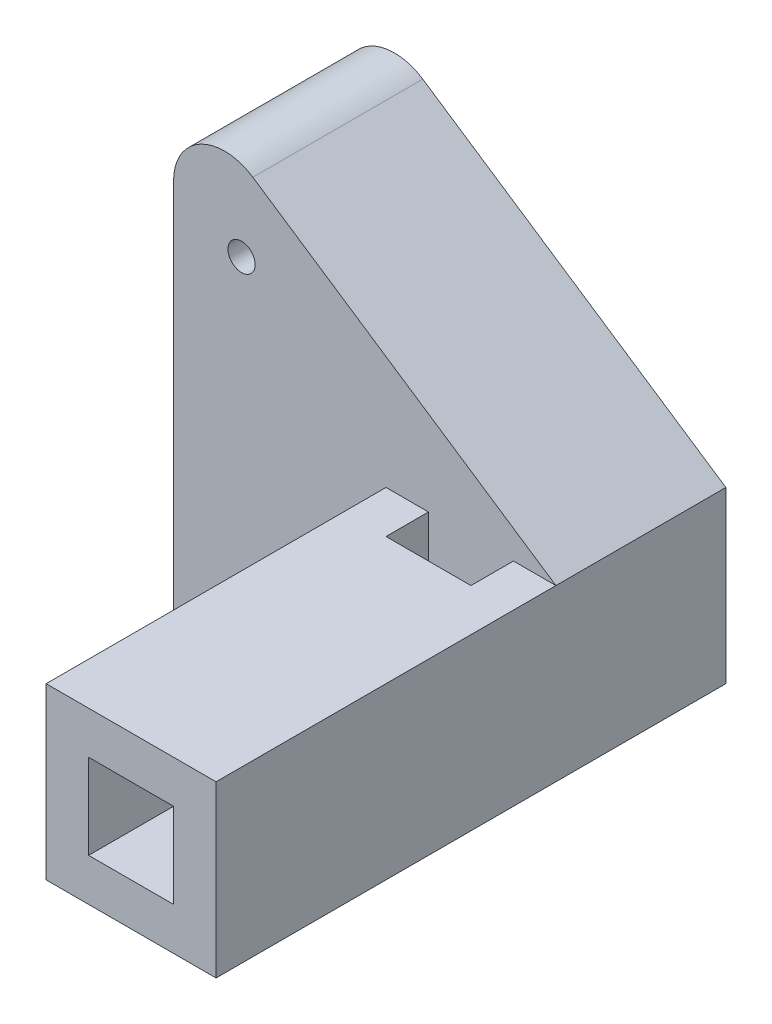
ISO-10303-21;
HEADER;
FILE_DESCRIPTION(('STEP AP214'),'2;1');
FILE_NAME('part.step','',(''),(''),'','','');
FILE_SCHEMA(('AUTOMOTIVE_DESIGN { 1 0 10303 214 1 1 1 1 }'));
ENDSEC;
DATA;
#1=APPLICATION_CONTEXT('core data for automotive mechanical design processes');
#2=APPLICATION_PROTOCOL_DEFINITION('international standard','automotive_design',2000,#1);
#3=PRODUCT_CONTEXT('',#1,'mechanical');
#4=PRODUCT('Part','Part','',(#3));
#5=PRODUCT_RELATED_PRODUCT_CATEGORY('part','',(#4));
#6=PRODUCT_DEFINITION_FORMATION('','',#4);
#7=PRODUCT_DEFINITION_CONTEXT('part definition',#1,'design');
#8=PRODUCT_DEFINITION('design','',#6,#7);
#9=PRODUCT_DEFINITION_SHAPE('','',#8);
#10=(LENGTH_UNIT() NAMED_UNIT(*) SI_UNIT(.MILLI.,.METRE.));
#11=(NAMED_UNIT(*) PLANE_ANGLE_UNIT() SI_UNIT($,.RADIAN.));
#12=(NAMED_UNIT(*) SI_UNIT($,.STERADIAN.) SOLID_ANGLE_UNIT());
#13=UNCERTAINTY_MEASURE_WITH_UNIT(LENGTH_MEASURE(1.E-05),#10,'distance_accuracy_value','');
#14=(GEOMETRIC_REPRESENTATION_CONTEXT(3) GLOBAL_UNCERTAINTY_ASSIGNED_CONTEXT((#13)) GLOBAL_UNIT_ASSIGNED_CONTEXT((#10,
#11,#12)) REPRESENTATION_CONTEXT('',''));
#15=CARTESIAN_POINT('',(0.,0.,0.));
#16=DIRECTION('',(0.,0.,1.));
#17=DIRECTION('',(1.,0.,0.));
#18=AXIS2_PLACEMENT_3D('',#15,#16,#17);
#19=CARTESIAN_POINT('',(-5.,-5.,60.));
#20=DIRECTION('',(1.,0.,0.));
#21=DIRECTION('',(0.,0.,-1.));
#22=AXIS2_PLACEMENT_3D('',#19,#20,#21);
#23=PLANE('',#22);
#24=DIRECTION('',(0.,1.,0.));
#25=VECTOR('',#24,1.);
#26=CARTESIAN_POINT('',(-5.,-5.,20.));
#27=LINE('',#26,#25);
#28=CARTESIAN_POINT('',(-5.,-5.,20.));
#29=VERTEX_POINT('',#28);
#30=CARTESIAN_POINT('',(-5.,15.,20.));
#31=VERTEX_POINT('',#30);
#32=EDGE_CURVE('E250',#29,#31,#27,.T.);
#33=ORIENTED_EDGE('',*,*,#32,.F.);
#34=DIRECTION('',(0.,0.,-1.));
#35=VECTOR('',#34,1.);
#36=CARTESIAN_POINT('',(-5.,-5.,60.));
#37=LINE('',#36,#35);
#38=CARTESIAN_POINT('',(-5.,-5.,60.));
#39=VERTEX_POINT('',#38);
#40=EDGE_CURVE('E330',#39,#29,#37,.T.);
#41=ORIENTED_EDGE('',*,*,#40,.F.);
#42=DIRECTION('',(0.,-1.,0.));
#43=VECTOR('',#42,1.);
#44=CARTESIAN_POINT('',(-5.,-5.,60.));
#45=LINE('',#44,#43);
#46=CARTESIAN_POINT('',(-5.,15.,60.));
#47=VERTEX_POINT('',#46);
#48=EDGE_CURVE('E311',#47,#39,#45,.T.);
#49=ORIENTED_EDGE('',*,*,#48,.F.);
#50=DIRECTION('',(0.,0.,-1.));
#51=VECTOR('',#50,1.);
#52=CARTESIAN_POINT('',(-5.,15.,60.));
#53=LINE('',#52,#51);
#54=EDGE_CURVE('E320',#47,#31,#53,.T.);
#55=ORIENTED_EDGE('',*,*,#54,.T.);
#56=EDGE_LOOP('',(#33,#41,#49,#55));
#57=FACE_BOUND('',#56,.T.);
#58=ADVANCED_FACE('F36',(#57),#23,.F.);
#59=CARTESIAN_POINT('',(-5.,-5.,60.));
#60=DIRECTION('',(0.,1.,0.));
#61=DIRECTION('',(0.,0.,1.));
#62=AXIS2_PLACEMENT_3D('',#59,#60,#61);
#63=PLANE('',#62);
#64=DIRECTION('',(-1.,0.,0.));
#65=VECTOR('',#64,1.);
#66=CARTESIAN_POINT('',(15.,-5.,20.));
#67=LINE('',#66,#65);
#68=CARTESIAN_POINT('',(15.,-5.,20.));
#69=VERTEX_POINT('',#68);
#70=CARTESIAN_POINT('',(10.,-5.,20.));
#71=VERTEX_POINT('',#70);
#72=EDGE_CURVE('E381',#69,#71,#67,.T.);
#73=ORIENTED_EDGE('',*,*,#72,.F.);
#74=DIRECTION('',(0.,0.,-1.));
#75=VECTOR('',#74,1.);
#76=CARTESIAN_POINT('',(15.,-5.,60.));
#77=LINE('',#76,#75);
#78=CARTESIAN_POINT('',(15.,-5.,60.));
#79=VERTEX_POINT('',#78);
#80=EDGE_CURVE('E327',#79,#69,#77,.T.);
#81=ORIENTED_EDGE('',*,*,#80,.F.);
#82=DIRECTION('',(1.,0.,0.));
#83=VECTOR('',#82,1.);
#84=CARTESIAN_POINT('',(-5.,-5.,60.));
#85=LINE('',#84,#83);
#86=EDGE_CURVE('E314',#39,#79,#85,.T.);
#87=ORIENTED_EDGE('',*,*,#86,.F.);
#88=ORIENTED_EDGE('',*,*,#40,.T.);
#89=CARTESIAN_POINT('',(0.,-5.,20.));
#90=VERTEX_POINT('',#89);
#91=EDGE_CURVE('E239',#90,#29,#67,.T.);
#92=ORIENTED_EDGE('',*,*,#91,.F.);
#93=DIRECTION('',(0.,0.,1.));
#94=VECTOR('',#93,1.);
#95=CARTESIAN_POINT('',(0.,-5.,60.));
#96=LINE('',#95,#94);
#97=CARTESIAN_POINT('',(0.,-5.,25.));
#98=VERTEX_POINT('',#97);
#99=EDGE_CURVE('E283',#90,#98,#96,.T.);
#100=ORIENTED_EDGE('',*,*,#99,.T.);
#101=DIRECTION('',(1.,0.,0.));
#102=VECTOR('',#101,1.);
#103=CARTESIAN_POINT('',(-5.,-5.,25.));
#104=LINE('',#103,#102);
#105=CARTESIAN_POINT('',(10.,-5.,25.));
#106=VERTEX_POINT('',#105);
#107=EDGE_CURVE('E275',#98,#106,#104,.T.);
#108=ORIENTED_EDGE('',*,*,#107,.T.);
#109=DIRECTION('',(0.,0.,-1.));
#110=VECTOR('',#109,1.);
#111=CARTESIAN_POINT('',(10.,-5.,60.));
#112=LINE('',#111,#110);
#113=EDGE_CURVE('E278',#106,#71,#112,.T.);
#114=ORIENTED_EDGE('',*,*,#113,.T.);
#115=EDGE_LOOP('',(#73,#81,#87,#88,#92,#100,#108,#114));
#116=FACE_BOUND('',#115,.T.);
#117=ADVANCED_FACE('F409',(#116),#63,.F.);
#118=CARTESIAN_POINT('',(-5.,15.,60.));
#119=DIRECTION('',(0.,-1.,0.));
#120=DIRECTION('',(0.,0.,-1.));
#121=AXIS2_PLACEMENT_3D('',#118,#119,#120);
#122=PLANE('',#121);
#123=DIRECTION('',(1.,0.,0.));
#124=VECTOR('',#123,1.);
#125=CARTESIAN_POINT('',(15.,15.,20.));
#126=LINE('',#125,#124);
#127=CARTESIAN_POINT('',(0.,15.,20.));
#128=VERTEX_POINT('',#127);
#129=EDGE_CURVE('E368',#31,#128,#126,.T.);
#130=ORIENTED_EDGE('',*,*,#129,.F.);
#131=ORIENTED_EDGE('',*,*,#54,.F.);
#132=DIRECTION('',(-1.,0.,0.));
#133=VECTOR('',#132,1.);
#134=CARTESIAN_POINT('',(-5.,15.,60.));
#135=LINE('',#134,#133);
#136=CARTESIAN_POINT('',(15.,15.,60.));
#137=VERTEX_POINT('',#136);
#138=EDGE_CURVE('E318',#137,#47,#135,.T.);
#139=ORIENTED_EDGE('',*,*,#138,.F.);
#140=DIRECTION('',(0.,0.,-1.));
#141=VECTOR('',#140,1.);
#142=CARTESIAN_POINT('',(15.,15.,60.));
#143=LINE('',#142,#141);
#144=CARTESIAN_POINT('',(15.,15.,20.));
#145=VERTEX_POINT('',#144);
#146=EDGE_CURVE('E324',#137,#145,#143,.T.);
#147=ORIENTED_EDGE('',*,*,#146,.T.);
#148=CARTESIAN_POINT('',(10.,15.,20.));
#149=VERTEX_POINT('',#148);
#150=EDGE_CURVE('E371',#149,#145,#126,.T.);
#151=ORIENTED_EDGE('',*,*,#150,.F.);
#152=DIRECTION('',(0.,0.,-1.));
#153=VECTOR('',#152,1.);
#154=CARTESIAN_POINT('',(10.,15.,20.));
#155=LINE('',#154,#153);
#156=CARTESIAN_POINT('',(10.,15.,25.));
#157=VERTEX_POINT('',#156);
#158=EDGE_CURVE('E256',#157,#149,#155,.T.);
#159=ORIENTED_EDGE('',*,*,#158,.F.);
#160=DIRECTION('',(1.,0.,0.));
#161=VECTOR('',#160,1.);
#162=CARTESIAN_POINT('',(0.,15.,25.));
#163=LINE('',#162,#161);
#164=CARTESIAN_POINT('',(0.,15.,25.));
#165=VERTEX_POINT('',#164);
#166=EDGE_CURVE('E253',#165,#157,#163,.T.);
#167=ORIENTED_EDGE('',*,*,#166,.F.);
#168=DIRECTION('',(0.,0.,1.));
#169=VECTOR('',#168,1.);
#170=CARTESIAN_POINT('',(0.,15.,20.));
#171=LINE('',#170,#169);
#172=EDGE_CURVE('E251',#128,#165,#171,.T.);
#173=ORIENTED_EDGE('',*,*,#172,.F.);
#174=EDGE_LOOP('',(#130,#131,#139,#147,#151,#159,#167,#173));
#175=FACE_BOUND('',#174,.T.);
#176=ADVANCED_FACE('F415',(#175),#122,.F.);
#177=CARTESIAN_POINT('',(0.,0.,60.));
#178=DIRECTION('',(0.,1.,0.));
#179=DIRECTION('',(0.,0.,1.));
#180=AXIS2_PLACEMENT_3D('',#177,#178,#179);
#181=PLANE('',#180);
#182=DIRECTION('',(0.,0.,-1.));
#183=VECTOR('',#182,1.);
#184=CARTESIAN_POINT('',(10.,0.,60.));
#185=LINE('',#184,#183);
#186=CARTESIAN_POINT('',(10.,0.,20.));
#187=VERTEX_POINT('',#186);
#188=CARTESIAN_POINT('',(10.,0.,1.00000000000001));
#189=VERTEX_POINT('',#188);
#190=EDGE_CURVE('E303',#187,#189,#185,.T.);
#191=ORIENTED_EDGE('',*,*,#190,.T.);
#192=DIRECTION('',(-1.,0.,0.));
#193=VECTOR('',#192,1.);
#194=CARTESIAN_POINT('',(0.,0.,1.));
#195=LINE('',#194,#193);
#196=CARTESIAN_POINT('',(0.,0.,1.00000000000001));
#197=VERTEX_POINT('',#196);
#198=EDGE_CURVE('E46',#189,#197,#195,.T.);
#199=ORIENTED_EDGE('',*,*,#198,.T.);
#200=DIRECTION('',(0.,0.,-1.));
#201=VECTOR('',#200,1.);
#202=CARTESIAN_POINT('',(0.,0.,60.));
#203=LINE('',#202,#201);
#204=CARTESIAN_POINT('',(0.,0.,20.));
#205=VERTEX_POINT('',#204);
#206=EDGE_CURVE('E307',#205,#197,#203,.T.);
#207=ORIENTED_EDGE('',*,*,#206,.F.);
#208=DIRECTION('',(-1.,0.,0.));
#209=VECTOR('',#208,1.);
#210=CARTESIAN_POINT('',(0.,0.,20.));
#211=LINE('',#210,#209);
#212=EDGE_CURVE('E281',#187,#205,#211,.T.);
#213=ORIENTED_EDGE('',*,*,#212,.F.);
#214=EDGE_LOOP('',(#191,#199,#207,#213));
#215=FACE_BOUND('',#214,.T.);
#216=ADVANCED_FACE('F476',(#215),#181,.T.);
#217=CARTESIAN_POINT('',(0.,10.,60.));
#218=DIRECTION('',(0.,-1.,0.));
#219=DIRECTION('',(0.,0.,-1.));
#220=AXIS2_PLACEMENT_3D('',#217,#218,#219);
#221=PLANE('',#220);
#222=DIRECTION('',(0.,0.,-1.));
#223=VECTOR('',#222,1.);
#224=CARTESIAN_POINT('',(0.,10.,60.));
#225=LINE('',#224,#223);
#226=CARTESIAN_POINT('',(0.,9.99999999999999,20.));
#227=VERTEX_POINT('',#226);
#228=CARTESIAN_POINT('',(0.,10.,1.00000000000001));
#229=VERTEX_POINT('',#228);
#230=EDGE_CURVE('E295',#227,#229,#225,.T.);
#231=ORIENTED_EDGE('',*,*,#230,.T.);
#232=DIRECTION('',(1.,0.,0.));
#233=VECTOR('',#232,1.);
#234=CARTESIAN_POINT('',(0.,10.,1.));
#235=LINE('',#234,#233);
#236=CARTESIAN_POINT('',(10.,10.,1.00000000000001));
#237=VERTEX_POINT('',#236);
#238=EDGE_CURVE('E346',#229,#237,#235,.T.);
#239=ORIENTED_EDGE('',*,*,#238,.T.);
#240=DIRECTION('',(0.,0.,-1.));
#241=VECTOR('',#240,1.);
#242=CARTESIAN_POINT('',(10.,10.,60.));
#243=LINE('',#242,#241);
#244=CARTESIAN_POINT('',(10.,9.99999999999999,20.));
#245=VERTEX_POINT('',#244);
#246=EDGE_CURVE('E299',#245,#237,#243,.T.);
#247=ORIENTED_EDGE('',*,*,#246,.F.);
#248=DIRECTION('',(1.,0.,0.));
#249=VECTOR('',#248,1.);
#250=CARTESIAN_POINT('',(0.,10.,20.));
#251=LINE('',#250,#249);
#252=EDGE_CURVE('E335',#227,#245,#251,.T.);
#253=ORIENTED_EDGE('',*,*,#252,.F.);
#254=EDGE_LOOP('',(#231,#239,#247,#253));
#255=FACE_BOUND('',#254,.T.);
#256=ADVANCED_FACE('F457',(#255),#221,.T.);
#257=CARTESIAN_POINT('',(0.,0.,60.));
#258=DIRECTION('',(0.,0.,-1.));
#259=DIRECTION('',(-1.,0.,0.));
#260=AXIS2_PLACEMENT_3D('',#257,#258,#259);
#261=PLANE('',#260);
#262=ORIENTED_EDGE('',*,*,#48,.T.);
#263=ORIENTED_EDGE('',*,*,#86,.T.);
#264=DIRECTION('',(0.,1.,0.));
#265=VECTOR('',#264,1.);
#266=CARTESIAN_POINT('',(15.,-5.,60.));
#267=LINE('',#266,#265);
#268=EDGE_CURVE('E316',#79,#137,#267,.T.);
#269=ORIENTED_EDGE('',*,*,#268,.T.);
#270=ORIENTED_EDGE('',*,*,#138,.T.);
#271=EDGE_LOOP('',(#262,#263,#269,#270));
#272=FACE_BOUND('',#271,.T.);
#273=DIRECTION('',(0.,-1.,0.));
#274=VECTOR('',#273,1.);
#275=CARTESIAN_POINT('',(0.,0.,60.));
#276=LINE('',#275,#274);
#277=CARTESIAN_POINT('',(0.,10.,60.));
#278=VERTEX_POINT('',#277);
#279=CARTESIAN_POINT('',(0.,0.,60.));
#280=VERTEX_POINT('',#279);
#281=EDGE_CURVE('E286',#278,#280,#276,.T.);
#282=ORIENTED_EDGE('',*,*,#281,.F.);
#283=DIRECTION('',(-1.,0.,0.));
#284=VECTOR('',#283,1.);
#285=CARTESIAN_POINT('',(0.,10.,60.));
#286=LINE('',#285,#284);
#287=CARTESIAN_POINT('',(10.,10.,60.));
#288=VERTEX_POINT('',#287);
#289=EDGE_CURVE('E293',#288,#278,#286,.T.);
#290=ORIENTED_EDGE('',*,*,#289,.F.);
#291=DIRECTION('',(0.,1.,0.));
#292=VECTOR('',#291,1.);
#293=CARTESIAN_POINT('',(10.,0.,60.));
#294=LINE('',#293,#292);
#295=CARTESIAN_POINT('',(10.,0.,60.));
#296=VERTEX_POINT('',#295);
#297=EDGE_CURVE('E290',#296,#288,#294,.T.);
#298=ORIENTED_EDGE('',*,*,#297,.F.);
#299=DIRECTION('',(1.,0.,0.));
#300=VECTOR('',#299,1.);
#301=CARTESIAN_POINT('',(0.,0.,60.));
#302=LINE('',#301,#300);
#303=EDGE_CURVE('E288',#280,#296,#302,.T.);
#304=ORIENTED_EDGE('',*,*,#303,.F.);
#305=EDGE_LOOP('',(#282,#290,#298,#304));
#306=FACE_BOUND('',#305,.T.);
#307=ADVANCED_FACE('F464',(#272,#306),#261,.F.);
#308=CARTESIAN_POINT('',(0.,0.,0.));
#309=DIRECTION('',(0.,0.,-1.));
#310=DIRECTION('',(-1.,0.,0.));
#311=AXIS2_PLACEMENT_3D('',#308,#309,#310);
#312=PLANE('',#311);
#313=DIRECTION('',(0.,1.,0.));
#314=VECTOR('',#313,1.);
#315=CARTESIAN_POINT('',(11.,0.,0.));
#316=LINE('',#315,#314);
#317=CARTESIAN_POINT('',(11.,-1.,0.));
#318=VERTEX_POINT('',#317);
#319=CARTESIAN_POINT('',(11.,11.,0.));
#320=VERTEX_POINT('',#319);
#321=EDGE_CURVE('E341',#318,#320,#316,.T.);
#322=ORIENTED_EDGE('',*,*,#321,.T.);
#323=DIRECTION('',(-1.,0.,0.));
#324=VECTOR('',#323,1.);
#325=CARTESIAN_POINT('',(0.,11.,0.));
#326=LINE('',#325,#324);
#327=CARTESIAN_POINT('',(-1.,11.,0.));
#328=VERTEX_POINT('',#327);
#329=EDGE_CURVE('E343',#320,#328,#326,.T.);
#330=ORIENTED_EDGE('',*,*,#329,.T.);
#331=DIRECTION('',(0.,-1.,0.));
#332=VECTOR('',#331,1.);
#333=CARTESIAN_POINT('',(-1.,0.,0.));
#334=LINE('',#333,#332);
#335=CARTESIAN_POINT('',(-1.,-1.,0.));
#336=VERTEX_POINT('',#335);
#337=EDGE_CURVE('E337',#328,#336,#334,.T.);
#338=ORIENTED_EDGE('',*,*,#337,.T.);
#339=DIRECTION('',(1.,0.,0.));
#340=VECTOR('',#339,1.);
#341=CARTESIAN_POINT('',(0.,-1.,0.));
#342=LINE('',#341,#340);
#343=EDGE_CURVE('E339',#336,#318,#342,.T.);
#344=ORIENTED_EDGE('',*,*,#343,.T.);
#345=EDGE_LOOP('',(#322,#330,#338,#344));
#346=FACE_BOUND('',#345,.T.);
#347=DIRECTION('',(0.,1.,0.));
#348=VECTOR('',#347,1.);
#349=CARTESIAN_POINT('',(15.,-5.,0.));
#350=LINE('',#349,#348);
#351=CARTESIAN_POINT('',(15.,-5.,0.));
#352=VERTEX_POINT('',#351);
#353=CARTESIAN_POINT('',(15.,15.,0.));
#354=VERTEX_POINT('',#353);
#355=EDGE_CURVE('E222',#352,#354,#350,.T.);
#356=ORIENTED_EDGE('',*,*,#355,.F.);
#357=DIRECTION('',(-0.832050294337844,-0.554700196225229,0.));
#358=VECTOR('',#357,1.);
#359=CARTESIAN_POINT('',(15.,-5.,0.));
#360=LINE('',#359,#358);
#361=CARTESIAN_POINT('',(-20.6717988226486,-28.781199215099,0.));
#362=VERTEX_POINT('',#361);
#363=EDGE_CURVE('E201',#352,#362,#360,.T.);
#364=ORIENTED_EDGE('',*,*,#363,.T.);
#365=CARTESIAN_POINT('',(-24.,-23.788897449072,0.));
#366=DIRECTION('',(0.,0.,-1.));
#367=DIRECTION('',(1.,0.,0.));
#368=AXIS2_PLACEMENT_3D('',#365,#366,#367);
#369=CIRCLE('',#368,6.);
#370=CARTESIAN_POINT('',(-30.,-23.7888974490719,0.));
#371=VERTEX_POINT('',#370);
#372=EDGE_CURVE('E210',#362,#371,#369,.T.);
#373=ORIENTED_EDGE('',*,*,#372,.T.);
#374=DIRECTION('',(0.,1.,0.));
#375=VECTOR('',#374,1.);
#376=CARTESIAN_POINT('',(-30.,33.7888974490719,0.));
#377=LINE('',#376,#375);
#378=CARTESIAN_POINT('',(-30.,33.7888974490719,0.));
#379=VERTEX_POINT('',#378);
#380=EDGE_CURVE('E216',#371,#379,#377,.T.);
#381=ORIENTED_EDGE('',*,*,#380,.T.);
#382=CARTESIAN_POINT('',(-24.,33.788897449072,0.));
#383=DIRECTION('',(0.,0.,-1.));
#384=DIRECTION('',(1.,0.,0.));
#385=AXIS2_PLACEMENT_3D('',#382,#383,#384);
#386=CIRCLE('',#385,6.);
#387=CARTESIAN_POINT('',(-20.6717988226485,38.781199215099,0.));
#388=VERTEX_POINT('',#387);
#389=EDGE_CURVE('E231',#379,#388,#386,.T.);
#390=ORIENTED_EDGE('',*,*,#389,.T.);
#391=DIRECTION('',(0.832050294337844,-0.554700196225229,0.));
#392=VECTOR('',#391,1.);
#393=CARTESIAN_POINT('',(15.,15.,0.));
#394=LINE('',#393,#392);
#395=EDGE_CURVE('E234',#388,#354,#394,.T.);
#396=ORIENTED_EDGE('',*,*,#395,.T.);
#397=EDGE_LOOP('',(#356,#364,#373,#381,#390,#396));
#398=FACE_BOUND('',#397,.T.);
#399=CARTESIAN_POINT('',(-22.,30.,0.));
#400=DIRECTION('',(0.,0.,-1.));
#401=DIRECTION('',(-1.,0.,0.));
#402=AXIS2_PLACEMENT_3D('',#399,#400,#401);
#403=CIRCLE('',#402,1.6);
#404=CARTESIAN_POINT('',(-23.6,30.,0.));
#405=VERTEX_POINT('',#404);
#406=EDGE_CURVE('E226',#405,#405,#403,.T.);
#407=ORIENTED_EDGE('',*,*,#406,.F.);
#408=EDGE_LOOP('',(#407));
#409=FACE_BOUND('',#408,.T.);
#410=CARTESIAN_POINT('',(-22.,-20.,0.));
#411=DIRECTION('',(0.,0.,-1.));
#412=DIRECTION('',(-1.,0.,0.));
#413=AXIS2_PLACEMENT_3D('',#410,#411,#412);
#414=CIRCLE('',#413,1.6);
#415=CARTESIAN_POINT('',(-23.6,-20.,0.));
#416=VERTEX_POINT('',#415);
#417=EDGE_CURVE('E223',#416,#416,#414,.T.);
#418=ORIENTED_EDGE('',*,*,#417,.F.);
#419=EDGE_LOOP('',(#418));
#420=FACE_BOUND('',#419,.T.);
#421=ADVANCED_FACE('F219',(#346,#398,#409,#420),#312,.T.);
#422=CARTESIAN_POINT('',(15.,-5.,60.));
#423=DIRECTION('',(-1.,0.,0.));
#424=DIRECTION('',(0.,0.,1.));
#425=AXIS2_PLACEMENT_3D('',#422,#423,#424);
#426=PLANE('',#425);
#427=ORIENTED_EDGE('',*,*,#355,.T.);
#428=DIRECTION('',(0.,0.,-1.));
#429=VECTOR('',#428,1.);
#430=CARTESIAN_POINT('',(15.,15.,102.861749576558));
#431=LINE('',#430,#429);
#432=EDGE_CURVE('E236',#145,#354,#431,.T.);
#433=ORIENTED_EDGE('',*,*,#432,.F.);
#434=ORIENTED_EDGE('',*,*,#146,.F.);
#435=ORIENTED_EDGE('',*,*,#268,.F.);
#436=ORIENTED_EDGE('',*,*,#80,.T.);
#437=DIRECTION('',(0.,0.,-1.));
#438=VECTOR('',#437,1.);
#439=CARTESIAN_POINT('',(15.,-5.,102.861749576558));
#440=LINE('',#439,#438);
#441=EDGE_CURVE('E207',#69,#352,#440,.T.);
#442=ORIENTED_EDGE('',*,*,#441,.T.);
#443=EDGE_LOOP('',(#427,#433,#434,#435,#436,#442));
#444=FACE_BOUND('',#443,.T.);
#445=ADVANCED_FACE('F463',(#444),#426,.F.);
#446=CARTESIAN_POINT('',(0.,0.,60.));
#447=DIRECTION('',(1.,0.,0.));
#448=DIRECTION('',(0.,0.,-1.));
#449=AXIS2_PLACEMENT_3D('',#446,#447,#448);
#450=PLANE('',#449);
#451=ORIENTED_EDGE('',*,*,#206,.T.);
#452=DIRECTION('',(0.,1.,0.));
#453=VECTOR('',#452,1.);
#454=CARTESIAN_POINT('',(0.,0.,1.));
#455=LINE('',#454,#453);
#456=EDGE_CURVE('E11',#197,#229,#455,.T.);
#457=ORIENTED_EDGE('',*,*,#456,.T.);
#458=ORIENTED_EDGE('',*,*,#230,.F.);
#459=DIRECTION('',(0.,1.,0.));
#460=VECTOR('',#459,1.);
#461=CARTESIAN_POINT('',(0.,-65.,20.));
#462=LINE('',#461,#460);
#463=EDGE_CURVE('E260',#227,#128,#462,.T.);
#464=ORIENTED_EDGE('',*,*,#463,.T.);
#465=ORIENTED_EDGE('',*,*,#172,.T.);
#466=DIRECTION('',(0.,1.,0.));
#467=VECTOR('',#466,1.);
#468=CARTESIAN_POINT('',(0.,-65.,25.));
#469=LINE('',#468,#467);
#470=CARTESIAN_POINT('',(0.,9.99999999999999,25.));
#471=VERTEX_POINT('',#470);
#472=EDGE_CURVE('E259',#471,#165,#469,.T.);
#473=ORIENTED_EDGE('',*,*,#472,.F.);
#474=EDGE_CURVE('E296',#278,#471,#225,.T.);
#475=ORIENTED_EDGE('',*,*,#474,.F.);
#476=ORIENTED_EDGE('',*,*,#281,.T.);
#477=CARTESIAN_POINT('',(0.,0.,25.));
#478=VERTEX_POINT('',#477);
#479=EDGE_CURVE('E308',#280,#478,#203,.T.);
#480=ORIENTED_EDGE('',*,*,#479,.T.);
#481=EDGE_CURVE('E270',#98,#478,#469,.T.);
#482=ORIENTED_EDGE('',*,*,#481,.F.);
#483=ORIENTED_EDGE('',*,*,#99,.F.);
#484=EDGE_CURVE('E262',#90,#205,#462,.T.);
#485=ORIENTED_EDGE('',*,*,#484,.T.);
#486=EDGE_LOOP('',(#451,#457,#458,#464,#465,#473,#475,#476,#480,#482,#483,#485));
#487=FACE_BOUND('',#486,.T.);
#488=ADVANCED_FACE('F452',(#487),#450,.T.);
#489=DIRECTION('',(1.,0.,0.));
#490=VECTOR('',#489,1.);
#491=CARTESIAN_POINT('',(0.,0.,25.));
#492=LINE('',#491,#490);
#493=CARTESIAN_POINT('',(10.,0.,25.));
#494=VERTEX_POINT('',#493);
#495=EDGE_CURVE('E273',#478,#494,#492,.T.);
#496=ORIENTED_EDGE('',*,*,#495,.F.);
#497=ORIENTED_EDGE('',*,*,#479,.F.);
#498=ORIENTED_EDGE('',*,*,#303,.T.);
#499=EDGE_CURVE('E304',#296,#494,#185,.T.);
#500=ORIENTED_EDGE('',*,*,#499,.T.);
#501=EDGE_LOOP('',(#496,#497,#498,#500));
#502=FACE_BOUND('',#501,.T.);
#503=ADVANCED_FACE('F482',(#502),#181,.T.);
#504=CARTESIAN_POINT('',(10.,0.,60.));
#505=DIRECTION('',(-1.,0.,0.));
#506=DIRECTION('',(0.,0.,1.));
#507=AXIS2_PLACEMENT_3D('',#504,#505,#506);
#508=PLANE('',#507);
#509=ORIENTED_EDGE('',*,*,#246,.T.);
#510=DIRECTION('',(0.,-1.,0.));
#511=VECTOR('',#510,1.);
#512=CARTESIAN_POINT('',(10.,0.,1.));
#513=LINE('',#512,#511);
#514=EDGE_CURVE('E61',#237,#189,#513,.T.);
#515=ORIENTED_EDGE('',*,*,#514,.T.);
#516=ORIENTED_EDGE('',*,*,#190,.F.);
#517=DIRECTION('',(0.,1.,0.));
#518=VECTOR('',#517,1.);
#519=CARTESIAN_POINT('',(10.,-65.,20.));
#520=LINE('',#519,#518);
#521=EDGE_CURVE('E263',#71,#187,#520,.T.);
#522=ORIENTED_EDGE('',*,*,#521,.F.);
#523=ORIENTED_EDGE('',*,*,#113,.F.);
#524=DIRECTION('',(0.,1.,0.));
#525=VECTOR('',#524,1.);
#526=CARTESIAN_POINT('',(10.,-65.,25.));
#527=LINE('',#526,#525);
#528=EDGE_CURVE('E267',#106,#494,#527,.T.);
#529=ORIENTED_EDGE('',*,*,#528,.T.);
#530=ORIENTED_EDGE('',*,*,#499,.F.);
#531=ORIENTED_EDGE('',*,*,#297,.T.);
#532=CARTESIAN_POINT('',(10.,10.,25.));
#533=VERTEX_POINT('',#532);
#534=EDGE_CURVE('E300',#288,#533,#243,.T.);
#535=ORIENTED_EDGE('',*,*,#534,.T.);
#536=EDGE_CURVE('E268',#533,#157,#527,.T.);
#537=ORIENTED_EDGE('',*,*,#536,.T.);
#538=ORIENTED_EDGE('',*,*,#158,.T.);
#539=EDGE_CURVE('E264',#245,#149,#520,.T.);
#540=ORIENTED_EDGE('',*,*,#539,.F.);
#541=EDGE_LOOP('',(#509,#515,#516,#522,#523,#529,#530,#531,#535,#537,#538,#540));
#542=FACE_BOUND('',#541,.T.);
#543=ADVANCED_FACE('F515',(#542),#508,.T.);
#544=DIRECTION('',(-1.,0.,0.));
#545=VECTOR('',#544,1.);
#546=CARTESIAN_POINT('',(0.,10.,25.));
#547=LINE('',#546,#545);
#548=EDGE_CURVE('E333',#533,#471,#547,.T.);
#549=ORIENTED_EDGE('',*,*,#548,.F.);
#550=ORIENTED_EDGE('',*,*,#534,.F.);
#551=ORIENTED_EDGE('',*,*,#289,.T.);
#552=ORIENTED_EDGE('',*,*,#474,.T.);
#553=EDGE_LOOP('',(#549,#550,#551,#552));
#554=FACE_BOUND('',#553,.T.);
#555=ADVANCED_FACE('F404',(#554),#221,.T.);
#556=CARTESIAN_POINT('',(0.,-65.,25.));
#557=DIRECTION('',(0.,0.,1.));
#558=DIRECTION('',(1.,0.,0.));
#559=AXIS2_PLACEMENT_3D('',#556,#557,#558);
#560=PLANE('',#559);
#561=ORIENTED_EDGE('',*,*,#548,.T.);
#562=ORIENTED_EDGE('',*,*,#472,.T.);
#563=ORIENTED_EDGE('',*,*,#166,.T.);
#564=ORIENTED_EDGE('',*,*,#536,.F.);
#565=EDGE_LOOP('',(#561,#562,#563,#564));
#566=FACE_BOUND('',#565,.T.);
#567=ADVANCED_FACE('F395',(#566),#560,.F.);
#568=CARTESIAN_POINT('',(0.,-65.,20.));
#569=DIRECTION('',(0.,0.,-1.));
#570=DIRECTION('',(-1.,0.,0.));
#571=AXIS2_PLACEMENT_3D('',#568,#569,#570);
#572=PLANE('',#571);
#573=ORIENTED_EDGE('',*,*,#521,.T.);
#574=ORIENTED_EDGE('',*,*,#212,.T.);
#575=ORIENTED_EDGE('',*,*,#484,.F.);
#576=ORIENTED_EDGE('',*,*,#91,.T.);
#577=ORIENTED_EDGE('',*,*,#32,.T.);
#578=ORIENTED_EDGE('',*,*,#129,.T.);
#579=ORIENTED_EDGE('',*,*,#463,.F.);
#580=ORIENTED_EDGE('',*,*,#252,.T.);
#581=ORIENTED_EDGE('',*,*,#539,.T.);
#582=ORIENTED_EDGE('',*,*,#150,.T.);
#583=DIRECTION('',(-0.832050294337844,0.554700196225229,0.));
#584=VECTOR('',#583,1.);
#585=CARTESIAN_POINT('',(15.,15.,20.));
#586=LINE('',#585,#584);
#587=CARTESIAN_POINT('',(-20.6717988226485,38.781199215099,20.));
#588=VERTEX_POINT('',#587);
#589=EDGE_CURVE('E372',#145,#588,#586,.T.);
#590=ORIENTED_EDGE('',*,*,#589,.T.);
#591=CARTESIAN_POINT('',(-24.,33.788897449072,20.));
#592=DIRECTION('',(0.,0.,-1.));
#593=DIRECTION('',(-1.,0.,0.));
#594=AXIS2_PLACEMENT_3D('',#591,#592,#593);
#595=CIRCLE('',#594,6.);
#596=CARTESIAN_POINT('',(-30.,33.7888974490719,20.));
#597=VERTEX_POINT('',#596);
#598=EDGE_CURVE('E374',#588,#597,#595,.F.);
#599=ORIENTED_EDGE('',*,*,#598,.T.);
#600=DIRECTION('',(0.,-1.,0.));
#601=VECTOR('',#600,1.);
#602=CARTESIAN_POINT('',(-30.,33.7888974490719,20.));
#603=LINE('',#602,#601);
#604=CARTESIAN_POINT('',(-30.,-23.788897449072,20.));
#605=VERTEX_POINT('',#604);
#606=EDGE_CURVE('E376',#597,#605,#603,.T.);
#607=ORIENTED_EDGE('',*,*,#606,.T.);
#608=CARTESIAN_POINT('',(-24.,-23.788897449072,20.));
#609=DIRECTION('',(0.,0.,-1.));
#610=DIRECTION('',(-1.,0.,0.));
#611=AXIS2_PLACEMENT_3D('',#608,#609,#610);
#612=CIRCLE('',#611,6.);
#613=CARTESIAN_POINT('',(-20.6717988226486,-28.781199215099,20.));
#614=VERTEX_POINT('',#613);
#615=EDGE_CURVE('E378',#605,#614,#612,.F.);
#616=ORIENTED_EDGE('',*,*,#615,.T.);
#617=DIRECTION('',(0.832050294337844,0.554700196225229,0.));
#618=VECTOR('',#617,1.);
#619=CARTESIAN_POINT('',(15.,-5.,20.));
#620=LINE('',#619,#618);
#621=EDGE_CURVE('E203',#614,#69,#620,.T.);
#622=ORIENTED_EDGE('',*,*,#621,.T.);
#623=ORIENTED_EDGE('',*,*,#72,.T.);
#624=EDGE_LOOP('',(#573,#574,#575,#576,#577,#578,#579,#580,#581,#582,#590,#599,#607,#616,#622,#623));
#625=FACE_BOUND('',#624,.T.);
#626=CARTESIAN_POINT('',(-22.,30.,20.));
#627=DIRECTION('',(0.,0.,-1.));
#628=DIRECTION('',(-1.,0.,0.));
#629=AXIS2_PLACEMENT_3D('',#626,#627,#628);
#630=CIRCLE('',#629,1.6);
#631=CARTESIAN_POINT('',(-23.6,30.,20.));
#632=VERTEX_POINT('',#631);
#633=EDGE_CURVE('E246',#632,#632,#630,.F.);
#634=ORIENTED_EDGE('',*,*,#633,.F.);
#635=EDGE_LOOP('',(#634));
#636=FACE_BOUND('',#635,.T.);
#637=CARTESIAN_POINT('',(-22.,-20.,20.));
#638=DIRECTION('',(0.,0.,-1.));
#639=DIRECTION('',(-1.,0.,0.));
#640=AXIS2_PLACEMENT_3D('',#637,#638,#639);
#641=CIRCLE('',#640,1.6);
#642=CARTESIAN_POINT('',(-23.6,-20.,20.));
#643=VERTEX_POINT('',#642);
#644=EDGE_CURVE('E249',#643,#643,#641,.F.);
#645=ORIENTED_EDGE('',*,*,#644,.F.);
#646=EDGE_LOOP('',(#645));
#647=FACE_BOUND('',#646,.T.);
#648=ADVANCED_FACE('F392',(#625,#636,#647),#572,.F.);
#649=ORIENTED_EDGE('',*,*,#481,.T.);
#650=ORIENTED_EDGE('',*,*,#495,.T.);
#651=ORIENTED_EDGE('',*,*,#528,.F.);
#652=ORIENTED_EDGE('',*,*,#107,.F.);
#653=EDGE_LOOP('',(#649,#650,#651,#652));
#654=FACE_BOUND('',#653,.T.);
#655=ADVANCED_FACE('F394',(#654),#560,.F.);
#656=CARTESIAN_POINT('',(15.,-5.,102.861749576558));
#657=DIRECTION('',(0.554700196225229,-0.832050294337844,0.));
#658=DIRECTION('',(0.832050294337844,0.554700196225229,0.));
#659=AXIS2_PLACEMENT_3D('',#656,#657,#658);
#660=PLANE('',#659);
#661=ORIENTED_EDGE('',*,*,#621,.F.);
#662=DIRECTION('',(0.,0.,-1.));
#663=VECTOR('',#662,1.);
#664=CARTESIAN_POINT('',(-20.6717988226486,-28.781199215099,102.861749576558));
#665=LINE('',#664,#663);
#666=EDGE_CURVE('E196',#614,#362,#665,.T.);
#667=ORIENTED_EDGE('',*,*,#666,.T.);
#668=ORIENTED_EDGE('',*,*,#363,.F.);
#669=ORIENTED_EDGE('',*,*,#441,.F.);
#670=EDGE_LOOP('',(#661,#667,#668,#669));
#671=FACE_BOUND('',#670,.T.);
#672=ADVANCED_FACE('F198',(#671),#660,.T.);
#673=CARTESIAN_POINT('',(-24.,-23.788897449072,102.861749576558));
#674=DIRECTION('',(0.,0.,-1.));
#675=DIRECTION('',(-1.,0.,0.));
#676=AXIS2_PLACEMENT_3D('',#673,#674,#675);
#677=CYLINDRICAL_SURFACE('',#676,6.);
#678=ORIENTED_EDGE('',*,*,#615,.F.);
#679=DIRECTION('',(0.,0.,-1.));
#680=VECTOR('',#679,1.);
#681=CARTESIAN_POINT('',(-30.,-23.7888974490719,102.861749576558));
#682=LINE('',#681,#680);
#683=EDGE_CURVE('E206',#605,#371,#682,.T.);
#684=ORIENTED_EDGE('',*,*,#683,.T.);
#685=ORIENTED_EDGE('',*,*,#372,.F.);
#686=ORIENTED_EDGE('',*,*,#666,.F.);
#687=EDGE_LOOP('',(#678,#684,#685,#686));
#688=FACE_BOUND('',#687,.T.);
#689=ADVANCED_FACE('F211',(#688),#677,.T.);
#690=CARTESIAN_POINT('',(-30.,33.7888974490719,102.861749576558));
#691=DIRECTION('',(-1.,0.,0.));
#692=DIRECTION('',(0.,-1.,0.));
#693=AXIS2_PLACEMENT_3D('',#690,#691,#692);
#694=PLANE('',#693);
#695=ORIENTED_EDGE('',*,*,#606,.F.);
#696=DIRECTION('',(0.,0.,-1.));
#697=VECTOR('',#696,1.);
#698=CARTESIAN_POINT('',(-30.,33.7888974490719,102.861749576558));
#699=LINE('',#698,#697);
#700=EDGE_CURVE('E242',#597,#379,#699,.T.);
#701=ORIENTED_EDGE('',*,*,#700,.T.);
#702=ORIENTED_EDGE('',*,*,#380,.F.);
#703=ORIENTED_EDGE('',*,*,#683,.F.);
#704=EDGE_LOOP('',(#695,#701,#702,#703));
#705=FACE_BOUND('',#704,.T.);
#706=ADVANCED_FACE('F511',(#705),#694,.T.);
#707=CARTESIAN_POINT('',(-24.,33.788897449072,102.861749576558));
#708=DIRECTION('',(0.,0.,-1.));
#709=DIRECTION('',(-1.,0.,0.));
#710=AXIS2_PLACEMENT_3D('',#707,#708,#709);
#711=CYLINDRICAL_SURFACE('',#710,6.);
#712=ORIENTED_EDGE('',*,*,#598,.F.);
#713=DIRECTION('',(0.,0.,-1.));
#714=VECTOR('',#713,1.);
#715=CARTESIAN_POINT('',(-20.6717988226485,38.781199215099,102.861749576558));
#716=LINE('',#715,#714);
#717=EDGE_CURVE('E240',#588,#388,#716,.T.);
#718=ORIENTED_EDGE('',*,*,#717,.T.);
#719=ORIENTED_EDGE('',*,*,#389,.F.);
#720=ORIENTED_EDGE('',*,*,#700,.F.);
#721=EDGE_LOOP('',(#712,#718,#719,#720));
#722=FACE_BOUND('',#721,.T.);
#723=ADVANCED_FACE('F507',(#722),#711,.T.);
#724=CARTESIAN_POINT('',(15.,15.,102.861749576558));
#725=DIRECTION('',(0.554700196225229,0.832050294337844,0.));
#726=DIRECTION('',(-0.832050294337844,0.554700196225229,0.));
#727=AXIS2_PLACEMENT_3D('',#724,#725,#726);
#728=PLANE('',#727);
#729=ORIENTED_EDGE('',*,*,#589,.F.);
#730=ORIENTED_EDGE('',*,*,#432,.T.);
#731=ORIENTED_EDGE('',*,*,#395,.F.);
#732=ORIENTED_EDGE('',*,*,#717,.F.);
#733=EDGE_LOOP('',(#729,#730,#731,#732));
#734=FACE_BOUND('',#733,.T.);
#735=ADVANCED_FACE('F503',(#734),#728,.T.);
#736=CARTESIAN_POINT('',(-22.,-20.,102.861749576558));
#737=DIRECTION('',(0.,0.,-1.));
#738=DIRECTION('',(-1.,0.,0.));
#739=AXIS2_PLACEMENT_3D('',#736,#737,#738);
#740=CYLINDRICAL_SURFACE('',#739,1.6);
#741=ORIENTED_EDGE('',*,*,#644,.T.);
#742=EDGE_LOOP('',(#741));
#743=FACE_BOUND('',#742,.T.);
#744=ORIENTED_EDGE('',*,*,#417,.T.);
#745=EDGE_LOOP('',(#744));
#746=FACE_BOUND('',#745,.T.);
#747=ADVANCED_FACE('F389',(#743,#746),#740,.F.);
#748=CARTESIAN_POINT('',(-22.,30.,102.861749576558));
#749=DIRECTION('',(0.,0.,-1.));
#750=DIRECTION('',(-1.,0.,0.));
#751=AXIS2_PLACEMENT_3D('',#748,#749,#750);
#752=CYLINDRICAL_SURFACE('',#751,1.6);
#753=ORIENTED_EDGE('',*,*,#633,.T.);
#754=EDGE_LOOP('',(#753));
#755=FACE_BOUND('',#754,.T.);
#756=ORIENTED_EDGE('',*,*,#406,.T.);
#757=EDGE_LOOP('',(#756));
#758=FACE_BOUND('',#757,.T.);
#759=ADVANCED_FACE('F440',(#755,#758),#752,.F.);
#760=CARTESIAN_POINT('',(0.,-1.,0.));
#761=DIRECTION('',(0.,-0.707106781186548,0.707106781186547));
#762=DIRECTION('',(1.,0.,0.));
#763=AXIS2_PLACEMENT_3D('',#760,#761,#762);
#764=PLANE('',#763);
#765=DIRECTION('',(-0.577350269189626,-0.577350269189626,-0.577350269189626));
#766=VECTOR('',#765,1.);
#767=CARTESIAN_POINT('',(-0.666666666666667,-0.666666666666667,0.333333333333333));
#768=LINE('',#767,#766);
#769=EDGE_CURVE('E354',#197,#336,#768,.T.);
#770=ORIENTED_EDGE('',*,*,#769,.F.);
#771=ORIENTED_EDGE('',*,*,#198,.F.);
#772=DIRECTION('',(0.577350269189626,-0.577350269189626,-0.577350269189626));
#773=VECTOR('',#772,1.);
#774=CARTESIAN_POINT('',(10.6666666666667,-0.666666666666667,0.333333333333333));
#775=LINE('',#774,#773);
#776=EDGE_CURVE('E41',#318,#189,#775,.F.);
#777=ORIENTED_EDGE('',*,*,#776,.F.);
#778=ORIENTED_EDGE('',*,*,#343,.F.);
#779=EDGE_LOOP('',(#770,#771,#777,#778));
#780=FACE_BOUND('',#779,.T.);
#781=ADVANCED_FACE('F39',(#780),#764,.F.);
#782=CARTESIAN_POINT('',(11.,0.,0.));
#783=DIRECTION('',(0.707106781186547,0.,0.707106781186547));
#784=DIRECTION('',(0.,1.,0.));
#785=AXIS2_PLACEMENT_3D('',#782,#783,#784);
#786=PLANE('',#785);
#787=ORIENTED_EDGE('',*,*,#776,.T.);
#788=ORIENTED_EDGE('',*,*,#514,.F.);
#789=DIRECTION('',(0.577350269189626,0.577350269189626,-0.577350269189626));
#790=VECTOR('',#789,1.);
#791=CARTESIAN_POINT('',(7.33333333333333,7.33333333333333,3.66666666666667));
#792=LINE('',#791,#790);
#793=EDGE_CURVE('E353',#320,#237,#792,.F.);
#794=ORIENTED_EDGE('',*,*,#793,.F.);
#795=ORIENTED_EDGE('',*,*,#321,.F.);
#796=EDGE_LOOP('',(#787,#788,#794,#795));
#797=FACE_BOUND('',#796,.T.);
#798=ADVANCED_FACE('F433',(#797),#786,.F.);
#799=CARTESIAN_POINT('',(-1.,0.,0.));
#800=DIRECTION('',(-0.707106781186548,0.,0.707106781186547));
#801=DIRECTION('',(0.,-1.,0.));
#802=AXIS2_PLACEMENT_3D('',#799,#800,#801);
#803=PLANE('',#802);
#804=ORIENTED_EDGE('',*,*,#769,.T.);
#805=ORIENTED_EDGE('',*,*,#337,.F.);
#806=DIRECTION('',(0.577350269189626,-0.577350269189626,0.577350269189626));
#807=VECTOR('',#806,1.);
#808=CARTESIAN_POINT('',(-0.666666666666667,10.6666666666667,0.333333333333333));
#809=LINE('',#808,#807);
#810=EDGE_CURVE('E351',#229,#328,#809,.F.);
#811=ORIENTED_EDGE('',*,*,#810,.F.);
#812=ORIENTED_EDGE('',*,*,#456,.F.);
#813=EDGE_LOOP('',(#804,#805,#811,#812));
#814=FACE_BOUND('',#813,.T.);
#815=ADVANCED_FACE('F427',(#814),#803,.F.);
#816=CARTESIAN_POINT('',(0.,11.,0.));
#817=DIRECTION('',(0.,0.707106781186547,0.707106781186547));
#818=DIRECTION('',(-1.,0.,0.));
#819=AXIS2_PLACEMENT_3D('',#816,#817,#818);
#820=PLANE('',#819);
#821=ORIENTED_EDGE('',*,*,#793,.T.);
#822=ORIENTED_EDGE('',*,*,#238,.F.);
#823=ORIENTED_EDGE('',*,*,#810,.T.);
#824=ORIENTED_EDGE('',*,*,#329,.F.);
#825=EDGE_LOOP('',(#821,#822,#823,#824));
#826=FACE_BOUND('',#825,.T.);
#827=ADVANCED_FACE('F421',(#826),#820,.F.);
#828=CLOSED_SHELL('',(#58,#117,#176,#216,#256,#307,#421,#445,#488,#503,#543,#555,#567,#648,#655,
#672,#689,#706,#723,#735,#747,#759,#781,#798,#815,#827));
#829=MANIFOLD_SOLID_BREP('B2',#828);
#830=ADVANCED_BREP_SHAPE_REPRESENTATION('',(#18,#829),#14);
#831=SHAPE_DEFINITION_REPRESENTATION(#9,#830);
ENDSEC;
END-ISO-10303-21;
